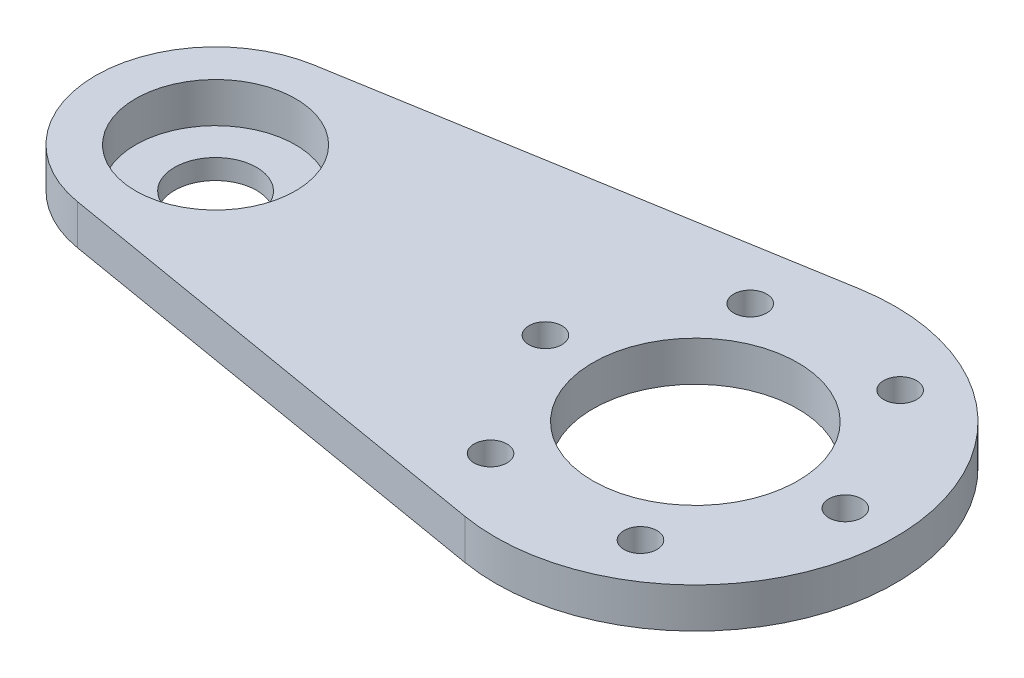
ISO-10303-21;
HEADER;
FILE_DESCRIPTION(('STEP AP214'),'2;1');
FILE_NAME('part.step','',(''),(''),'','','');
FILE_SCHEMA(('AUTOMOTIVE_DESIGN { 1 0 10303 214 1 1 1 1 }'));
ENDSEC;
DATA;
#1=APPLICATION_CONTEXT('core data for automotive mechanical design processes');
#2=APPLICATION_PROTOCOL_DEFINITION('international standard','automotive_design',2000,#1);
#3=PRODUCT_CONTEXT('',#1,'mechanical');
#4=PRODUCT('Part','Part','',(#3));
#5=PRODUCT_RELATED_PRODUCT_CATEGORY('part','',(#4));
#6=PRODUCT_DEFINITION_FORMATION('','',#4);
#7=PRODUCT_DEFINITION_CONTEXT('part definition',#1,'design');
#8=PRODUCT_DEFINITION('design','',#6,#7);
#9=PRODUCT_DEFINITION_SHAPE('','',#8);
#10=(LENGTH_UNIT() NAMED_UNIT(*) SI_UNIT(.MILLI.,.METRE.));
#11=(NAMED_UNIT(*) PLANE_ANGLE_UNIT() SI_UNIT($,.RADIAN.));
#12=(NAMED_UNIT(*) SI_UNIT($,.STERADIAN.) SOLID_ANGLE_UNIT());
#13=UNCERTAINTY_MEASURE_WITH_UNIT(LENGTH_MEASURE(1.E-05),#10,'distance_accuracy_value','');
#14=(GEOMETRIC_REPRESENTATION_CONTEXT(3) GLOBAL_UNCERTAINTY_ASSIGNED_CONTEXT((#13)) GLOBAL_UNIT_ASSIGNED_CONTEXT((#10,
#11,#12)) REPRESENTATION_CONTEXT('',''));
#15=CARTESIAN_POINT('',(0.,0.,0.));
#16=DIRECTION('',(0.,0.,1.));
#17=DIRECTION('',(1.,0.,0.));
#18=AXIS2_PLACEMENT_3D('',#15,#16,#17);
#19=CARTESIAN_POINT('',(-3.33333333333333,4.,19.7202659436654));
#20=DIRECTION('',(0.166666666666666,0.,-0.986013297183269));
#21=DIRECTION('',(-0.986013297183269,0.,-0.166666666666667));
#22=AXIS2_PLACEMENT_3D('',#19,#20,#21);
#23=PLANE('',#22);
#24=DIRECTION('',(0.986013297183269,0.,0.166666666666667));
#25=VECTOR('',#24,1.);
#26=CARTESIAN_POINT('',(-3.33333333333333,0.,19.7202659436654));
#27=LINE('',#26,#25);
#28=CARTESIAN_POINT('',(-50.,0.,11.8321595661992));
#29=VERTEX_POINT('',#28);
#30=CARTESIAN_POINT('',(-3.33333333333333,0.,19.7202659436654));
#31=VERTEX_POINT('',#30);
#32=EDGE_CURVE('E137',#29,#31,#27,.T.);
#33=ORIENTED_EDGE('',*,*,#32,.T.);
#34=DIRECTION('',(0.,-1.,0.));
#35=VECTOR('',#34,1.);
#36=CARTESIAN_POINT('',(-3.33333333333333,4.,19.7202659436654));
#37=LINE('',#36,#35);
#38=CARTESIAN_POINT('',(-3.33333333333333,4.,19.7202659436654));
#39=VERTEX_POINT('',#38);
#40=EDGE_CURVE('E54',#39,#31,#37,.T.);
#41=ORIENTED_EDGE('',*,*,#40,.F.);
#42=DIRECTION('',(0.986013297183269,0.,0.166666666666667));
#43=VECTOR('',#42,1.);
#44=CARTESIAN_POINT('',(-3.33333333333333,4.,19.7202659436654));
#45=LINE('',#44,#43);
#46=CARTESIAN_POINT('',(-50.,4.,11.8321595661992));
#47=VERTEX_POINT('',#46);
#48=EDGE_CURVE('E96',#47,#39,#45,.T.);
#49=ORIENTED_EDGE('',*,*,#48,.F.);
#50=DIRECTION('',(0.,-1.,0.));
#51=VECTOR('',#50,1.);
#52=CARTESIAN_POINT('',(-50.,4.,11.8321595661992));
#53=LINE('',#52,#51);
#54=EDGE_CURVE('E136',#47,#29,#53,.T.);
#55=ORIENTED_EDGE('',*,*,#54,.T.);
#56=EDGE_LOOP('',(#33,#41,#49,#55));
#57=FACE_BOUND('',#56,.T.);
#58=ADVANCED_FACE('F45',(#57),#23,.F.);
#59=CARTESIAN_POINT('',(0.,4.,0.));
#60=DIRECTION('',(0.,-1.,0.));
#61=DIRECTION('',(0.,0.,-1.));
#62=AXIS2_PLACEMENT_3D('',#59,#60,#61);
#63=CYLINDRICAL_SURFACE('',#62,20.);
#64=CARTESIAN_POINT('',(0.,0.,0.));
#65=DIRECTION('',(0.,1.,0.));
#66=DIRECTION('',(0.,0.,1.));
#67=AXIS2_PLACEMENT_3D('',#64,#65,#66);
#68=CIRCLE('',#67,20.);
#69=CARTESIAN_POINT('',(-3.33333333333333,0.,-19.7202659436654));
#70=VERTEX_POINT('',#69);
#71=EDGE_CURVE('E102',#31,#70,#68,.T.);
#72=ORIENTED_EDGE('',*,*,#71,.T.);
#73=DIRECTION('',(0.,-1.,0.));
#74=VECTOR('',#73,1.);
#75=CARTESIAN_POINT('',(-3.33333333333333,4.,-19.7202659436654));
#76=LINE('',#75,#74);
#77=CARTESIAN_POINT('',(-3.33333333333333,4.,-19.7202659436654));
#78=VERTEX_POINT('',#77);
#79=EDGE_CURVE('E100',#78,#70,#76,.T.);
#80=ORIENTED_EDGE('',*,*,#79,.F.);
#81=CARTESIAN_POINT('',(0.,4.,0.));
#82=DIRECTION('',(0.,1.,0.));
#83=DIRECTION('',(0.,0.,1.));
#84=AXIS2_PLACEMENT_3D('',#81,#82,#83);
#85=CIRCLE('',#84,20.);
#86=EDGE_CURVE('E90',#39,#78,#85,.T.);
#87=ORIENTED_EDGE('',*,*,#86,.F.);
#88=ORIENTED_EDGE('',*,*,#40,.T.);
#89=EDGE_LOOP('',(#72,#80,#87,#88));
#90=FACE_BOUND('',#89,.T.);
#91=ADVANCED_FACE('F101',(#90),#63,.T.);
#92=CARTESIAN_POINT('',(-3.33333333333333,4.,-19.7202659436654));
#93=DIRECTION('',(-0.166666666666667,0.,-0.986013297183269));
#94=DIRECTION('',(-0.986013297183269,0.,0.166666666666667));
#95=AXIS2_PLACEMENT_3D('',#92,#93,#94);
#96=PLANE('',#95);
#97=DIRECTION('',(0.986013297183269,0.,-0.166666666666667));
#98=VECTOR('',#97,1.);
#99=CARTESIAN_POINT('',(-3.33333333333333,0.,-19.7202659436654));
#100=LINE('',#99,#98);
#101=CARTESIAN_POINT('',(-50.,0.,-11.8321595661992));
#102=VERTEX_POINT('',#101);
#103=EDGE_CURVE('E142',#102,#70,#100,.T.);
#104=ORIENTED_EDGE('',*,*,#103,.F.);
#105=DIRECTION('',(0.,-1.,0.));
#106=VECTOR('',#105,1.);
#107=CARTESIAN_POINT('',(-50.,4.,-11.8321595661992));
#108=LINE('',#107,#106);
#109=CARTESIAN_POINT('',(-50.,4.,-11.8321595661992));
#110=VERTEX_POINT('',#109);
#111=EDGE_CURVE('E105',#110,#102,#108,.T.);
#112=ORIENTED_EDGE('',*,*,#111,.F.);
#113=DIRECTION('',(0.986013297183269,0.,-0.166666666666667));
#114=VECTOR('',#113,1.);
#115=CARTESIAN_POINT('',(-3.33333333333333,4.,-19.7202659436654));
#116=LINE('',#115,#114);
#117=EDGE_CURVE('E94',#110,#78,#116,.T.);
#118=ORIENTED_EDGE('',*,*,#117,.T.);
#119=ORIENTED_EDGE('',*,*,#79,.T.);
#120=EDGE_LOOP('',(#104,#112,#118,#119));
#121=FACE_BOUND('',#120,.T.);
#122=ADVANCED_FACE('F107',(#121),#96,.T.);
#123=CARTESIAN_POINT('',(0.,4.,0.));
#124=DIRECTION('',(0.,-1.,0.));
#125=DIRECTION('',(0.,0.,-1.));
#126=AXIS2_PLACEMENT_3D('',#123,#124,#125);
#127=CYLINDRICAL_SURFACE('',#126,10.25);
#128=CARTESIAN_POINT('',(0.,4.,0.));
#129=DIRECTION('',(0.,1.,0.));
#130=DIRECTION('',(0.,0.,1.));
#131=AXIS2_PLACEMENT_3D('',#128,#129,#130);
#132=CIRCLE('',#131,10.25);
#133=CARTESIAN_POINT('',(0.,4.,10.25));
#134=VERTEX_POINT('',#133);
#135=EDGE_CURVE('E130',#134,#134,#132,.T.);
#136=ORIENTED_EDGE('',*,*,#135,.T.);
#137=EDGE_LOOP('',(#136));
#138=FACE_BOUND('',#137,.T.);
#139=CARTESIAN_POINT('',(0.,0.,0.));
#140=DIRECTION('',(0.,1.,0.));
#141=DIRECTION('',(0.,0.,1.));
#142=AXIS2_PLACEMENT_3D('',#139,#140,#141);
#143=CIRCLE('',#142,10.25);
#144=CARTESIAN_POINT('',(0.,0.,10.25));
#145=VERTEX_POINT('',#144);
#146=EDGE_CURVE('E164',#145,#145,#143,.T.);
#147=ORIENTED_EDGE('',*,*,#146,.F.);
#148=EDGE_LOOP('',(#147));
#149=FACE_BOUND('',#148,.T.);
#150=ADVANCED_FACE('F205',(#138,#149),#127,.F.);
#151=CARTESIAN_POINT('',(-7.50000000000001,4.,-12.9903810567666));
#152=DIRECTION('',(0.,-1.,0.));
#153=DIRECTION('',(0.,0.,-1.));
#154=AXIS2_PLACEMENT_3D('',#151,#152,#153);
#155=CYLINDRICAL_SURFACE('',#154,1.65000000000001);
#156=CARTESIAN_POINT('',(-7.50000000000001,4.,-12.9903810567666));
#157=DIRECTION('',(0.,1.,0.));
#158=DIRECTION('',(0.,0.,1.));
#159=AXIS2_PLACEMENT_3D('',#156,#157,#158);
#160=CIRCLE('',#159,1.65000000000001);
#161=CARTESIAN_POINT('',(-7.50000000000001,4.,-11.3403810567666));
#162=VERTEX_POINT('',#161);
#163=EDGE_CURVE('E127',#162,#162,#160,.T.);
#164=ORIENTED_EDGE('',*,*,#163,.T.);
#165=EDGE_LOOP('',(#164));
#166=FACE_BOUND('',#165,.T.);
#167=CARTESIAN_POINT('',(-7.50000000000001,0.,-12.9903810567666));
#168=DIRECTION('',(0.,1.,0.));
#169=DIRECTION('',(0.,0.,1.));
#170=AXIS2_PLACEMENT_3D('',#167,#168,#169);
#171=CIRCLE('',#170,1.65000000000001);
#172=CARTESIAN_POINT('',(-7.50000000000001,0.,-11.3403810567666));
#173=VERTEX_POINT('',#172);
#174=EDGE_CURVE('E161',#173,#173,#171,.T.);
#175=ORIENTED_EDGE('',*,*,#174,.F.);
#176=EDGE_LOOP('',(#175));
#177=FACE_BOUND('',#176,.T.);
#178=ADVANCED_FACE('F228',(#166,#177),#155,.F.);
#179=CARTESIAN_POINT('',(7.50000000000006,4.,-12.9903810567665));
#180=DIRECTION('',(0.,-1.,0.));
#181=DIRECTION('',(0.,0.,-1.));
#182=AXIS2_PLACEMENT_3D('',#179,#180,#181);
#183=CYLINDRICAL_SURFACE('',#182,1.65);
#184=CARTESIAN_POINT('',(7.50000000000006,4.,-12.9903810567665));
#185=DIRECTION('',(0.,1.,0.));
#186=DIRECTION('',(0.,0.,1.));
#187=AXIS2_PLACEMENT_3D('',#184,#185,#186);
#188=CIRCLE('',#187,1.65);
#189=CARTESIAN_POINT('',(7.50000000000006,4.,-11.3403810567665));
#190=VERTEX_POINT('',#189);
#191=EDGE_CURVE('E124',#190,#190,#188,.T.);
#192=ORIENTED_EDGE('',*,*,#191,.T.);
#193=EDGE_LOOP('',(#192));
#194=FACE_BOUND('',#193,.T.);
#195=CARTESIAN_POINT('',(7.50000000000006,0.,-12.9903810567665));
#196=DIRECTION('',(0.,1.,0.));
#197=DIRECTION('',(0.,0.,1.));
#198=AXIS2_PLACEMENT_3D('',#195,#196,#197);
#199=CIRCLE('',#198,1.65);
#200=CARTESIAN_POINT('',(7.50000000000006,0.,-11.3403810567665));
#201=VERTEX_POINT('',#200);
#202=EDGE_CURVE('E158',#201,#201,#199,.T.);
#203=ORIENTED_EDGE('',*,*,#202,.F.);
#204=EDGE_LOOP('',(#203));
#205=FACE_BOUND('',#204,.T.);
#206=ADVANCED_FACE('F224',(#194,#205),#183,.F.);
#207=CARTESIAN_POINT('',(15.,4.,1.04744440165294E-13));
#208=DIRECTION('',(0.,-1.,0.));
#209=DIRECTION('',(0.,0.,-1.));
#210=AXIS2_PLACEMENT_3D('',#207,#208,#209);
#211=CYLINDRICAL_SURFACE('',#210,1.65);
#212=CARTESIAN_POINT('',(15.,4.,1.04744440165294E-13));
#213=DIRECTION('',(0.,1.,0.));
#214=DIRECTION('',(0.,0.,1.));
#215=AXIS2_PLACEMENT_3D('',#212,#213,#214);
#216=CIRCLE('',#215,1.65);
#217=CARTESIAN_POINT('',(15.,4.,1.65000000000011));
#218=VERTEX_POINT('',#217);
#219=EDGE_CURVE('E121',#218,#218,#216,.T.);
#220=ORIENTED_EDGE('',*,*,#219,.T.);
#221=EDGE_LOOP('',(#220));
#222=FACE_BOUND('',#221,.T.);
#223=CARTESIAN_POINT('',(15.,0.,1.04744440165294E-13));
#224=DIRECTION('',(0.,1.,0.));
#225=DIRECTION('',(0.,0.,1.));
#226=AXIS2_PLACEMENT_3D('',#223,#224,#225);
#227=CIRCLE('',#226,1.65);
#228=CARTESIAN_POINT('',(15.,0.,1.65000000000011));
#229=VERTEX_POINT('',#228);
#230=EDGE_CURVE('E155',#229,#229,#227,.T.);
#231=ORIENTED_EDGE('',*,*,#230,.F.);
#232=EDGE_LOOP('',(#231));
#233=FACE_BOUND('',#232,.T.);
#234=ADVANCED_FACE('F220',(#222,#233),#211,.F.);
#235=CARTESIAN_POINT('',(7.49999999999988,4.,12.9903810567667));
#236=DIRECTION('',(0.,-1.,0.));
#237=DIRECTION('',(0.,0.,-1.));
#238=AXIS2_PLACEMENT_3D('',#235,#236,#237);
#239=CYLINDRICAL_SURFACE('',#238,1.65);
#240=CARTESIAN_POINT('',(7.49999999999988,4.,12.9903810567667));
#241=DIRECTION('',(0.,1.,0.));
#242=DIRECTION('',(0.,0.,1.));
#243=AXIS2_PLACEMENT_3D('',#240,#241,#242);
#244=CIRCLE('',#243,1.65);
#245=CARTESIAN_POINT('',(7.49999999999988,4.,14.6403810567667));
#246=VERTEX_POINT('',#245);
#247=EDGE_CURVE('E118',#246,#246,#244,.T.);
#248=ORIENTED_EDGE('',*,*,#247,.T.);
#249=EDGE_LOOP('',(#248));
#250=FACE_BOUND('',#249,.T.);
#251=CARTESIAN_POINT('',(7.49999999999988,0.,12.9903810567667));
#252=DIRECTION('',(0.,1.,0.));
#253=DIRECTION('',(0.,0.,1.));
#254=AXIS2_PLACEMENT_3D('',#251,#252,#253);
#255=CIRCLE('',#254,1.65);
#256=CARTESIAN_POINT('',(7.49999999999988,0.,14.6403810567667));
#257=VERTEX_POINT('',#256);
#258=EDGE_CURVE('E152',#257,#257,#255,.T.);
#259=ORIENTED_EDGE('',*,*,#258,.F.);
#260=EDGE_LOOP('',(#259));
#261=FACE_BOUND('',#260,.T.);
#262=ADVANCED_FACE('F216',(#250,#261),#239,.F.);
#263=CARTESIAN_POINT('',(-7.49999999999999,4.,12.9903810567666));
#264=DIRECTION('',(0.,-1.,0.));
#265=DIRECTION('',(0.,0.,-1.));
#266=AXIS2_PLACEMENT_3D('',#263,#264,#265);
#267=CYLINDRICAL_SURFACE('',#266,1.65000000000006);
#268=CARTESIAN_POINT('',(-7.49999999999999,4.,12.9903810567666));
#269=DIRECTION('',(0.,1.,0.));
#270=DIRECTION('',(0.,0.,1.));
#271=AXIS2_PLACEMENT_3D('',#268,#269,#270);
#272=CIRCLE('',#271,1.65000000000006);
#273=CARTESIAN_POINT('',(-7.49999999999999,4.,14.6403810567666));
#274=VERTEX_POINT('',#273);
#275=EDGE_CURVE('E115',#274,#274,#272,.T.);
#276=ORIENTED_EDGE('',*,*,#275,.T.);
#277=EDGE_LOOP('',(#276));
#278=FACE_BOUND('',#277,.T.);
#279=CARTESIAN_POINT('',(-7.49999999999999,0.,12.9903810567666));
#280=DIRECTION('',(0.,1.,0.));
#281=DIRECTION('',(0.,0.,1.));
#282=AXIS2_PLACEMENT_3D('',#279,#280,#281);
#283=CIRCLE('',#282,1.65000000000006);
#284=CARTESIAN_POINT('',(-7.49999999999999,0.,14.6403810567666));
#285=VERTEX_POINT('',#284);
#286=EDGE_CURVE('E149',#285,#285,#283,.T.);
#287=ORIENTED_EDGE('',*,*,#286,.F.);
#288=EDGE_LOOP('',(#287));
#289=FACE_BOUND('',#288,.T.);
#290=ADVANCED_FACE('F212',(#278,#289),#267,.F.);
#291=CARTESIAN_POINT('',(-15.,4.,0.));
#292=DIRECTION('',(0.,-1.,0.));
#293=DIRECTION('',(0.,0.,-1.));
#294=AXIS2_PLACEMENT_3D('',#291,#292,#293);
#295=CYLINDRICAL_SURFACE('',#294,1.65);
#296=CARTESIAN_POINT('',(-15.,4.,0.));
#297=DIRECTION('',(0.,1.,0.));
#298=DIRECTION('',(0.,0.,1.));
#299=AXIS2_PLACEMENT_3D('',#296,#297,#298);
#300=CIRCLE('',#299,1.65);
#301=CARTESIAN_POINT('',(-15.,4.,1.65));
#302=VERTEX_POINT('',#301);
#303=EDGE_CURVE('E109',#302,#302,#300,.T.);
#304=ORIENTED_EDGE('',*,*,#303,.T.);
#305=EDGE_LOOP('',(#304));
#306=FACE_BOUND('',#305,.T.);
#307=CARTESIAN_POINT('',(-15.,0.,0.));
#308=DIRECTION('',(0.,1.,0.));
#309=DIRECTION('',(0.,0.,1.));
#310=AXIS2_PLACEMENT_3D('',#307,#308,#309);
#311=CIRCLE('',#310,1.65);
#312=CARTESIAN_POINT('',(-15.,0.,1.65));
#313=VERTEX_POINT('',#312);
#314=EDGE_CURVE('E146',#313,#313,#311,.T.);
#315=ORIENTED_EDGE('',*,*,#314,.F.);
#316=EDGE_LOOP('',(#315));
#317=FACE_BOUND('',#316,.T.);
#318=ADVANCED_FACE('F209',(#306,#317),#295,.F.);
#319=CARTESIAN_POINT('',(-48.,4.,0.));
#320=DIRECTION('',(0.,-1.,0.));
#321=DIRECTION('',(0.,0.,-1.));
#322=AXIS2_PLACEMENT_3D('',#319,#320,#321);
#323=CYLINDRICAL_SURFACE('',#322,12.);
#324=CARTESIAN_POINT('',(-48.,0.,0.));
#325=DIRECTION('',(0.,1.,0.));
#326=DIRECTION('',(0.,0.,1.));
#327=AXIS2_PLACEMENT_3D('',#324,#325,#326);
#328=CIRCLE('',#327,12.);
#329=EDGE_CURVE('E144',#102,#29,#328,.T.);
#330=ORIENTED_EDGE('',*,*,#329,.T.);
#331=ORIENTED_EDGE('',*,*,#54,.F.);
#332=CARTESIAN_POINT('',(-48.,4.,0.));
#333=DIRECTION('',(0.,1.,0.));
#334=DIRECTION('',(0.,0.,1.));
#335=AXIS2_PLACEMENT_3D('',#332,#333,#334);
#336=CIRCLE('',#335,12.);
#337=EDGE_CURVE('E62',#110,#47,#336,.T.);
#338=ORIENTED_EDGE('',*,*,#337,.F.);
#339=ORIENTED_EDGE('',*,*,#111,.T.);
#340=EDGE_LOOP('',(#330,#331,#338,#339));
#341=FACE_BOUND('',#340,.T.);
#342=ADVANCED_FACE('F177',(#341),#323,.T.);
#343=CARTESIAN_POINT('',(-48.,4.,0.));
#344=DIRECTION('',(0.,-1.,0.));
#345=DIRECTION('',(0.,0.,-1.));
#346=AXIS2_PLACEMENT_3D('',#343,#344,#345);
#347=CYLINDRICAL_SURFACE('',#346,8.);
#348=CARTESIAN_POINT('',(-48.,4.,0.));
#349=DIRECTION('',(0.,1.,0.));
#350=DIRECTION('',(0.,0.,1.));
#351=AXIS2_PLACEMENT_3D('',#348,#349,#350);
#352=CIRCLE('',#351,8.);
#353=CARTESIAN_POINT('',(-48.,4.,8.));
#354=VERTEX_POINT('',#353);
#355=EDGE_CURVE('E133',#354,#354,#352,.T.);
#356=ORIENTED_EDGE('',*,*,#355,.T.);
#357=EDGE_LOOP('',(#356));
#358=FACE_BOUND('',#357,.T.);
#359=CARTESIAN_POINT('',(-48.,0.,0.));
#360=DIRECTION('',(0.,1.,0.));
#361=DIRECTION('',(0.,0.,1.));
#362=AXIS2_PLACEMENT_3D('',#359,#360,#361);
#363=CIRCLE('',#362,8.);
#364=CARTESIAN_POINT('',(-48.,0.,8.));
#365=VERTEX_POINT('',#364);
#366=EDGE_CURVE('E167',#365,#365,#363,.T.);
#367=ORIENTED_EDGE('',*,*,#366,.F.);
#368=EDGE_LOOP('',(#367));
#369=FACE_BOUND('',#368,.T.);
#370=ADVANCED_FACE('F208',(#358,#369),#347,.F.);
#371=CARTESIAN_POINT('',(0.,4.,0.));
#372=DIRECTION('',(0.,1.,0.));
#373=DIRECTION('',(0.,0.,1.));
#374=AXIS2_PLACEMENT_3D('',#371,#372,#373);
#375=PLANE('',#374);
#376=ORIENTED_EDGE('',*,*,#48,.T.);
#377=ORIENTED_EDGE('',*,*,#86,.T.);
#378=ORIENTED_EDGE('',*,*,#117,.F.);
#379=ORIENTED_EDGE('',*,*,#337,.T.);
#380=EDGE_LOOP('',(#376,#377,#378,#379));
#381=FACE_BOUND('',#380,.T.);
#382=ORIENTED_EDGE('',*,*,#303,.F.);
#383=EDGE_LOOP('',(#382));
#384=FACE_BOUND('',#383,.T.);
#385=ORIENTED_EDGE('',*,*,#275,.F.);
#386=EDGE_LOOP('',(#385));
#387=FACE_BOUND('',#386,.T.);
#388=ORIENTED_EDGE('',*,*,#247,.F.);
#389=EDGE_LOOP('',(#388));
#390=FACE_BOUND('',#389,.T.);
#391=ORIENTED_EDGE('',*,*,#219,.F.);
#392=EDGE_LOOP('',(#391));
#393=FACE_BOUND('',#392,.T.);
#394=ORIENTED_EDGE('',*,*,#191,.F.);
#395=EDGE_LOOP('',(#394));
#396=FACE_BOUND('',#395,.T.);
#397=ORIENTED_EDGE('',*,*,#163,.F.);
#398=EDGE_LOOP('',(#397));
#399=FACE_BOUND('',#398,.T.);
#400=ORIENTED_EDGE('',*,*,#135,.F.);
#401=EDGE_LOOP('',(#400));
#402=FACE_BOUND('',#401,.T.);
#403=ORIENTED_EDGE('',*,*,#355,.F.);
#404=EDGE_LOOP('',(#403));
#405=FACE_BOUND('',#404,.T.);
#406=ADVANCED_FACE('F91',(#381,#384,#387,#390,#393,#396,#399,#402,#405),#375,.T.);
#407=CARTESIAN_POINT('',(0.,0.,0.));
#408=DIRECTION('',(0.,1.,0.));
#409=DIRECTION('',(0.,0.,1.));
#410=AXIS2_PLACEMENT_3D('',#407,#408,#409);
#411=PLANE('',#410);
#412=ORIENTED_EDGE('',*,*,#32,.F.);
#413=CARTESIAN_POINT('',(-48.,0.,0.));
#414=DIRECTION('',(0.,1.,0.));
#415=DIRECTION('',(0.,0.,1.));
#416=AXIS2_PLACEMENT_3D('',#413,#414,#415);
#417=CIRCLE('',#416,12.);
#418=EDGE_CURVE('E11',#29,#102,#417,.T.);
#419=ORIENTED_EDGE('',*,*,#418,.T.);
#420=ORIENTED_EDGE('',*,*,#103,.T.);
#421=ORIENTED_EDGE('',*,*,#71,.F.);
#422=EDGE_LOOP('',(#412,#419,#420,#421));
#423=FACE_BOUND('',#422,.T.);
#424=ORIENTED_EDGE('',*,*,#314,.T.);
#425=EDGE_LOOP('',(#424));
#426=FACE_BOUND('',#425,.T.);
#427=ORIENTED_EDGE('',*,*,#286,.T.);
#428=EDGE_LOOP('',(#427));
#429=FACE_BOUND('',#428,.T.);
#430=ORIENTED_EDGE('',*,*,#258,.T.);
#431=EDGE_LOOP('',(#430));
#432=FACE_BOUND('',#431,.T.);
#433=ORIENTED_EDGE('',*,*,#230,.T.);
#434=EDGE_LOOP('',(#433));
#435=FACE_BOUND('',#434,.T.);
#436=ORIENTED_EDGE('',*,*,#202,.T.);
#437=EDGE_LOOP('',(#436));
#438=FACE_BOUND('',#437,.T.);
#439=ORIENTED_EDGE('',*,*,#174,.T.);
#440=EDGE_LOOP('',(#439));
#441=FACE_BOUND('',#440,.T.);
#442=ORIENTED_EDGE('',*,*,#146,.T.);
#443=EDGE_LOOP('',(#442));
#444=FACE_BOUND('',#443,.T.);
#445=ADVANCED_FACE('F173',(#423,#426,#429,#432,#435,#438,#441,#444),#411,.F.);
#446=CARTESIAN_POINT('',(-48.,0.,0.));
#447=DIRECTION('',(0.,-1.,0.));
#448=DIRECTION('',(0.,0.,-1.));
#449=AXIS2_PLACEMENT_3D('',#446,#447,#448);
#450=PLANE('',#449);
#451=ORIENTED_EDGE('',*,*,#366,.T.);
#452=EDGE_LOOP('',(#451));
#453=FACE_BOUND('',#452,.T.);
#454=CARTESIAN_POINT('',(-48.,0.,0.));
#455=DIRECTION('',(0.,-1.,0.));
#456=DIRECTION('',(0.,0.,-1.));
#457=AXIS2_PLACEMENT_3D('',#454,#455,#456);
#458=CIRCLE('',#457,4.1);
#459=CARTESIAN_POINT('',(-48.,0.,-4.09999999999999));
#460=VERTEX_POINT('',#459);
#461=EDGE_CURVE('E182',#460,#460,#458,.T.);
#462=ORIENTED_EDGE('',*,*,#461,.T.);
#463=EDGE_LOOP('',(#462));
#464=FACE_BOUND('',#463,.T.);
#465=ADVANCED_FACE('F240',(#453,#464),#450,.F.);
#466=CARTESIAN_POINT('',(-48.,-30.2842712474619,0.));
#467=DIRECTION('',(0.,1.,0.));
#468=DIRECTION('',(0.,0.,1.));
#469=AXIS2_PLACEMENT_3D('',#466,#467,#468);
#470=CYLINDRICAL_SURFACE('',#469,4.1);
#471=ORIENTED_EDGE('',*,*,#461,.F.);
#472=EDGE_LOOP('',(#471));
#473=FACE_BOUND('',#472,.T.);
#474=CARTESIAN_POINT('',(-48.,-2.,0.));
#475=DIRECTION('',(0.,-1.,0.));
#476=DIRECTION('',(0.,0.,-1.));
#477=AXIS2_PLACEMENT_3D('',#474,#475,#476);
#478=CIRCLE('',#477,4.1);
#479=CARTESIAN_POINT('',(-48.,-2.,-4.09999999999999));
#480=VERTEX_POINT('',#479);
#481=EDGE_CURVE('E179',#480,#480,#478,.T.);
#482=ORIENTED_EDGE('',*,*,#481,.T.);
#483=EDGE_LOOP('',(#482));
#484=FACE_BOUND('',#483,.T.);
#485=ADVANCED_FACE('F195',(#473,#484),#470,.F.);
#486=CARTESIAN_POINT('',(-48.,-2.,0.));
#487=DIRECTION('',(0.,-1.,0.));
#488=DIRECTION('',(0.,0.,-1.));
#489=AXIS2_PLACEMENT_3D('',#486,#487,#488);
#490=PLANE('',#489);
#491=CARTESIAN_POINT('',(-48.,-2.,0.));
#492=DIRECTION('',(0.,-1.,0.));
#493=DIRECTION('',(0.,0.,-1.));
#494=AXIS2_PLACEMENT_3D('',#491,#492,#493);
#495=CIRCLE('',#494,10.);
#496=CARTESIAN_POINT('',(-48.,-2.,-9.99999999999999));
#497=VERTEX_POINT('',#496);
#498=EDGE_CURVE('E140',#497,#497,#495,.T.);
#499=ORIENTED_EDGE('',*,*,#498,.T.);
#500=EDGE_LOOP('',(#499));
#501=FACE_BOUND('',#500,.T.);
#502=ORIENTED_EDGE('',*,*,#481,.F.);
#503=EDGE_LOOP('',(#502));
#504=FACE_BOUND('',#503,.T.);
#505=ADVANCED_FACE('F188',(#501,#504),#490,.T.);
#506=CARTESIAN_POINT('',(-48.,-2.,0.));
#507=DIRECTION('',(0.,1.,0.));
#508=DIRECTION('',(0.,0.,1.));
#509=AXIS2_PLACEMENT_3D('',#506,#507,#508);
#510=TOROIDAL_SURFACE('',#509,12.,2.);
#511=ORIENTED_EDGE('',*,*,#418,.F.);
#512=ORIENTED_EDGE('',*,*,#329,.F.);
#513=EDGE_LOOP('',(#511,#512));
#514=FACE_BOUND('',#513,.T.);
#515=ORIENTED_EDGE('',*,*,#498,.F.);
#516=EDGE_LOOP('',(#515));
#517=FACE_BOUND('',#516,.T.);
#518=ADVANCED_FACE('F47',(#514,#517),#510,.F.);
#519=CLOSED_SHELL('',(#58,#91,#122,#150,#178,#206,#234,#262,#290,#318,#342,#370,#406,#445,#465,
#485,#505,#518));
#520=MANIFOLD_SOLID_BREP('B2',#519);
#521=ADVANCED_BREP_SHAPE_REPRESENTATION('',(#18,#520),#14);
#522=SHAPE_DEFINITION_REPRESENTATION(#9,#521);
ENDSEC;
END-ISO-10303-21;
